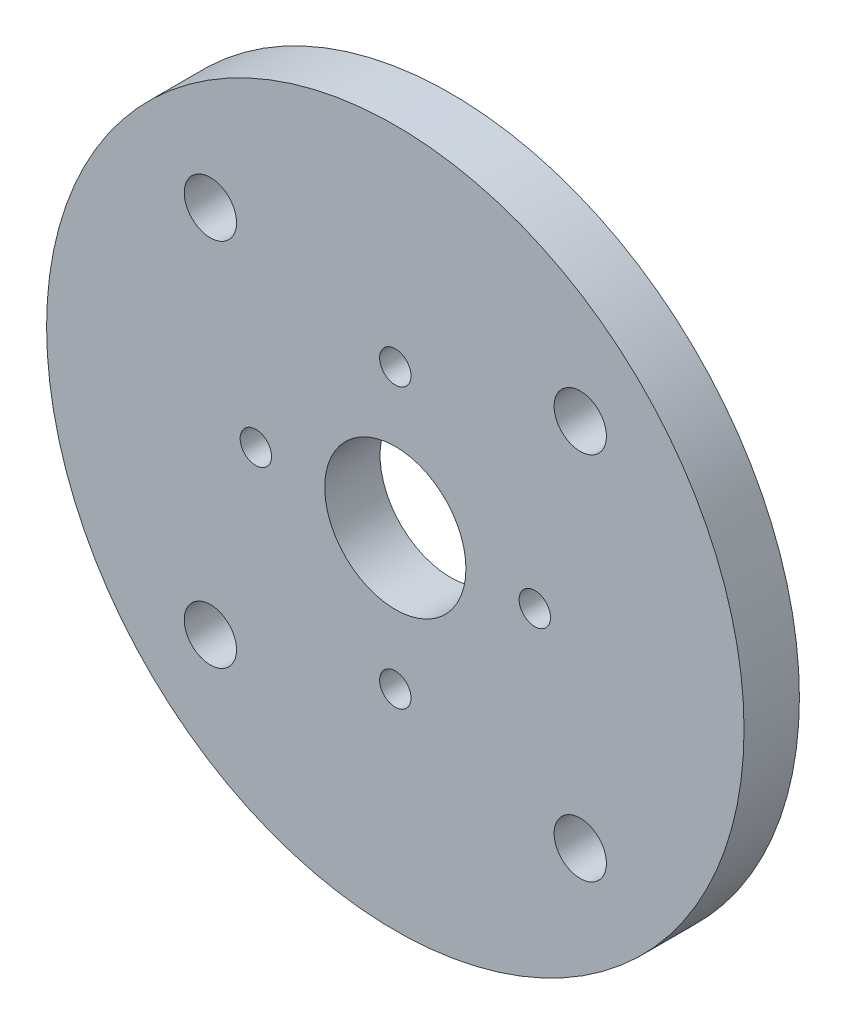
ISO-10303-21;
HEADER;
FILE_DESCRIPTION(('STEP AP214'),'2;1');
FILE_NAME('part.step','',(''),(''),'','','');
FILE_SCHEMA(('AUTOMOTIVE_DESIGN { 1 0 10303 214 1 1 1 1 }'));
ENDSEC;
DATA;
#1=APPLICATION_CONTEXT('core data for automotive mechanical design processes');
#2=APPLICATION_PROTOCOL_DEFINITION('international standard','automotive_design',2000,#1);
#3=PRODUCT_CONTEXT('',#1,'mechanical');
#4=PRODUCT('Part','Part','',(#3));
#5=PRODUCT_RELATED_PRODUCT_CATEGORY('part','',(#4));
#6=PRODUCT_DEFINITION_FORMATION('','',#4);
#7=PRODUCT_DEFINITION_CONTEXT('part definition',#1,'design');
#8=PRODUCT_DEFINITION('design','',#6,#7);
#9=PRODUCT_DEFINITION_SHAPE('','',#8);
#10=(LENGTH_UNIT() NAMED_UNIT(*) SI_UNIT(.MILLI.,.METRE.));
#11=(NAMED_UNIT(*) PLANE_ANGLE_UNIT() SI_UNIT($,.RADIAN.));
#12=(NAMED_UNIT(*) SI_UNIT($,.STERADIAN.) SOLID_ANGLE_UNIT());
#13=UNCERTAINTY_MEASURE_WITH_UNIT(LENGTH_MEASURE(1.E-05),#10,'distance_accuracy_value','');
#14=(GEOMETRIC_REPRESENTATION_CONTEXT(3) GLOBAL_UNCERTAINTY_ASSIGNED_CONTEXT((#13)) GLOBAL_UNIT_ASSIGNED_CONTEXT((#10,
#11,#12)) REPRESENTATION_CONTEXT('',''));
#15=CARTESIAN_POINT('',(0.,0.,0.));
#16=DIRECTION('',(0.,0.,1.));
#17=DIRECTION('',(1.,0.,0.));
#18=AXIS2_PLACEMENT_3D('',#15,#16,#17);
#19=CARTESIAN_POINT('',(0.,0.,3.175));
#20=DIRECTION('',(0.,0.,-1.));
#21=DIRECTION('',(-1.,0.,0.));
#22=AXIS2_PLACEMENT_3D('',#19,#20,#21);
#23=CYLINDRICAL_SURFACE('',#22,20.);
#24=CARTESIAN_POINT('',(0.,0.,3.175));
#25=DIRECTION('',(0.,0.,1.));
#26=DIRECTION('',(1.,0.,0.));
#27=AXIS2_PLACEMENT_3D('',#24,#25,#26);
#28=CIRCLE('',#27,20.);
#29=CARTESIAN_POINT('',(20.,0.,3.175));
#30=VERTEX_POINT('',#29);
#31=EDGE_CURVE('E10',#30,#30,#28,.T.);
#32=ORIENTED_EDGE('',*,*,#31,.F.);
#33=EDGE_LOOP('',(#32));
#34=FACE_BOUND('',#33,.T.);
#35=CARTESIAN_POINT('',(0.,0.,0.));
#36=DIRECTION('',(0.,0.,1.));
#37=DIRECTION('',(1.,0.,0.));
#38=AXIS2_PLACEMENT_3D('',#35,#36,#37);
#39=CIRCLE('',#38,20.);
#40=CARTESIAN_POINT('',(20.,0.,0.));
#41=VERTEX_POINT('',#40);
#42=EDGE_CURVE('E39',#41,#41,#39,.T.);
#43=ORIENTED_EDGE('',*,*,#42,.T.);
#44=EDGE_LOOP('',(#43));
#45=FACE_BOUND('',#44,.T.);
#46=ADVANCED_FACE('F36',(#34,#45),#23,.T.);
#47=CARTESIAN_POINT('',(0.,0.,3.175));
#48=DIRECTION('',(0.,0.,1.));
#49=DIRECTION('',(1.,0.,0.));
#50=AXIS2_PLACEMENT_3D('',#47,#48,#49);
#51=PLANE('',#50);
#52=CARTESIAN_POINT('',(-10.6066017177982,10.6066017177982,3.175));
#53=DIRECTION('',(0.,0.,1.));
#54=DIRECTION('',(1.,0.,0.));
#55=AXIS2_PLACEMENT_3D('',#52,#53,#54);
#56=CIRCLE('',#55,1.5);
#57=CARTESIAN_POINT('',(-9.10660171779824,10.6066017177982,3.175));
#58=VERTEX_POINT('',#57);
#59=EDGE_CURVE('E79',#58,#58,#56,.T.);
#60=ORIENTED_EDGE('',*,*,#59,.F.);
#61=EDGE_LOOP('',(#60));
#62=FACE_BOUND('',#61,.T.);
#63=CARTESIAN_POINT('',(-10.6066017177982,-10.6066017177982,3.175));
#64=DIRECTION('',(0.,0.,1.));
#65=DIRECTION('',(1.,0.,0.));
#66=AXIS2_PLACEMENT_3D('',#63,#64,#65);
#67=CIRCLE('',#66,1.5);
#68=CARTESIAN_POINT('',(-9.10660171779819,-10.6066017177982,3.175));
#69=VERTEX_POINT('',#68);
#70=EDGE_CURVE('E93',#69,#69,#67,.T.);
#71=ORIENTED_EDGE('',*,*,#70,.F.);
#72=EDGE_LOOP('',(#71));
#73=FACE_BOUND('',#72,.T.);
#74=CARTESIAN_POINT('',(10.6066017177982,-10.6066017177982,3.175));
#75=DIRECTION('',(0.,0.,1.));
#76=DIRECTION('',(1.,0.,0.));
#77=AXIS2_PLACEMENT_3D('',#74,#75,#76);
#78=CIRCLE('',#77,1.5);
#79=CARTESIAN_POINT('',(12.1066017177982,-10.6066017177982,3.175));
#80=VERTEX_POINT('',#79);
#81=EDGE_CURVE('E97',#80,#80,#78,.T.);
#82=ORIENTED_EDGE('',*,*,#81,.F.);
#83=EDGE_LOOP('',(#82));
#84=FACE_BOUND('',#83,.T.);
#85=CARTESIAN_POINT('',(10.6066017177982,10.6066017177982,3.175));
#86=DIRECTION('',(0.,0.,1.));
#87=DIRECTION('',(1.,0.,0.));
#88=AXIS2_PLACEMENT_3D('',#85,#86,#87);
#89=CIRCLE('',#88,1.5);
#90=CARTESIAN_POINT('',(12.1066017177982,10.6066017177982,3.175));
#91=VERTEX_POINT('',#90);
#92=EDGE_CURVE('E101',#91,#91,#89,.T.);
#93=ORIENTED_EDGE('',*,*,#92,.F.);
#94=EDGE_LOOP('',(#93));
#95=FACE_BOUND('',#94,.T.);
#96=CARTESIAN_POINT('',(0.,8.,3.175));
#97=DIRECTION('',(0.,0.,1.));
#98=DIRECTION('',(1.,0.,0.));
#99=AXIS2_PLACEMENT_3D('',#96,#97,#98);
#100=CIRCLE('',#99,0.9);
#101=CARTESIAN_POINT('',(0.9,8.,3.175));
#102=VERTEX_POINT('',#101);
#103=EDGE_CURVE('E67',#102,#102,#100,.T.);
#104=ORIENTED_EDGE('',*,*,#103,.F.);
#105=EDGE_LOOP('',(#104));
#106=FACE_BOUND('',#105,.T.);
#107=CARTESIAN_POINT('',(8.,0.,3.175));
#108=DIRECTION('',(0.,0.,1.));
#109=DIRECTION('',(1.,0.,0.));
#110=AXIS2_PLACEMENT_3D('',#107,#108,#109);
#111=CIRCLE('',#110,0.9);
#112=CARTESIAN_POINT('',(8.9,0.,3.175));
#113=VERTEX_POINT('',#112);
#114=EDGE_CURVE('E58',#113,#113,#111,.T.);
#115=ORIENTED_EDGE('',*,*,#114,.F.);
#116=EDGE_LOOP('',(#115));
#117=FACE_BOUND('',#116,.T.);
#118=CARTESIAN_POINT('',(0.,-8.,3.175));
#119=DIRECTION('',(0.,0.,1.));
#120=DIRECTION('',(1.,0.,0.));
#121=AXIS2_PLACEMENT_3D('',#118,#119,#120);
#122=CIRCLE('',#121,0.9);
#123=CARTESIAN_POINT('',(0.899999999999998,-8.,3.175));
#124=VERTEX_POINT('',#123);
#125=EDGE_CURVE('E83',#124,#124,#122,.T.);
#126=ORIENTED_EDGE('',*,*,#125,.F.);
#127=EDGE_LOOP('',(#126));
#128=FACE_BOUND('',#127,.T.);
#129=CARTESIAN_POINT('',(-8.,0.,3.175));
#130=DIRECTION('',(0.,0.,1.));
#131=DIRECTION('',(1.,0.,0.));
#132=AXIS2_PLACEMENT_3D('',#129,#130,#131);
#133=CIRCLE('',#132,0.899999999999999);
#134=CARTESIAN_POINT('',(-7.1,0.,3.175));
#135=VERTEX_POINT('',#134);
#136=EDGE_CURVE('E74',#135,#135,#133,.T.);
#137=ORIENTED_EDGE('',*,*,#136,.F.);
#138=EDGE_LOOP('',(#137));
#139=FACE_BOUND('',#138,.T.);
#140=CARTESIAN_POINT('',(0.,0.,3.175));
#141=DIRECTION('',(0.,0.,1.));
#142=DIRECTION('',(1.,0.,0.));
#143=AXIS2_PLACEMENT_3D('',#140,#141,#142);
#144=CIRCLE('',#143,4.05);
#145=CARTESIAN_POINT('',(4.05,0.,3.175));
#146=VERTEX_POINT('',#145);
#147=EDGE_CURVE('E50',#146,#146,#144,.T.);
#148=ORIENTED_EDGE('',*,*,#147,.F.);
#149=EDGE_LOOP('',(#148));
#150=FACE_BOUND('',#149,.T.);
#151=ORIENTED_EDGE('',*,*,#31,.T.);
#152=EDGE_LOOP('',(#151));
#153=FACE_BOUND('',#152,.T.);
#154=ADVANCED_FACE('F142',(#62,#73,#84,#95,#106,#117,#128,#139,#150,#153),#51,.T.);
#155=CARTESIAN_POINT('',(0.,0.,0.));
#156=DIRECTION('',(0.,0.,1.));
#157=DIRECTION('',(1.,0.,0.));
#158=AXIS2_PLACEMENT_3D('',#155,#156,#157);
#159=PLANE('',#158);
#160=CARTESIAN_POINT('',(-10.6066017177982,10.6066017177982,0.));
#161=DIRECTION('',(0.,0.,1.));
#162=DIRECTION('',(1.,0.,0.));
#163=AXIS2_PLACEMENT_3D('',#160,#161,#162);
#164=CIRCLE('',#163,1.5);
#165=CARTESIAN_POINT('',(-9.10660171779824,10.6066017177982,0.));
#166=VERTEX_POINT('',#165);
#167=EDGE_CURVE('E110',#166,#166,#164,.T.);
#168=ORIENTED_EDGE('',*,*,#167,.T.);
#169=EDGE_LOOP('',(#168));
#170=FACE_BOUND('',#169,.T.);
#171=CARTESIAN_POINT('',(-10.6066017177982,-10.6066017177982,0.));
#172=DIRECTION('',(0.,0.,1.));
#173=DIRECTION('',(1.,0.,0.));
#174=AXIS2_PLACEMENT_3D('',#171,#172,#173);
#175=CIRCLE('',#174,1.5);
#176=CARTESIAN_POINT('',(-9.10660171779819,-10.6066017177982,0.));
#177=VERTEX_POINT('',#176);
#178=EDGE_CURVE('E114',#177,#177,#175,.T.);
#179=ORIENTED_EDGE('',*,*,#178,.T.);
#180=EDGE_LOOP('',(#179));
#181=FACE_BOUND('',#180,.T.);
#182=CARTESIAN_POINT('',(10.6066017177982,-10.6066017177982,0.));
#183=DIRECTION('',(0.,0.,1.));
#184=DIRECTION('',(1.,0.,0.));
#185=AXIS2_PLACEMENT_3D('',#182,#183,#184);
#186=CIRCLE('',#185,1.5);
#187=CARTESIAN_POINT('',(12.1066017177982,-10.6066017177982,0.));
#188=VERTEX_POINT('',#187);
#189=EDGE_CURVE('E109',#188,#188,#186,.T.);
#190=ORIENTED_EDGE('',*,*,#189,.T.);
#191=EDGE_LOOP('',(#190));
#192=FACE_BOUND('',#191,.T.);
#193=CARTESIAN_POINT('',(10.6066017177982,10.6066017177982,0.));
#194=DIRECTION('',(0.,0.,1.));
#195=DIRECTION('',(1.,0.,0.));
#196=AXIS2_PLACEMENT_3D('',#193,#194,#195);
#197=CIRCLE('',#196,1.5);
#198=CARTESIAN_POINT('',(12.1066017177982,10.6066017177982,0.));
#199=VERTEX_POINT('',#198);
#200=EDGE_CURVE('E105',#199,#199,#197,.T.);
#201=ORIENTED_EDGE('',*,*,#200,.T.);
#202=EDGE_LOOP('',(#201));
#203=FACE_BOUND('',#202,.T.);
#204=CARTESIAN_POINT('',(0.,8.,0.));
#205=DIRECTION('',(0.,0.,1.));
#206=DIRECTION('',(1.,0.,0.));
#207=AXIS2_PLACEMENT_3D('',#204,#205,#206);
#208=CIRCLE('',#207,0.9);
#209=CARTESIAN_POINT('',(0.9,8.,0.));
#210=VERTEX_POINT('',#209);
#211=EDGE_CURVE('E54',#210,#210,#208,.T.);
#212=ORIENTED_EDGE('',*,*,#211,.T.);
#213=EDGE_LOOP('',(#212));
#214=FACE_BOUND('',#213,.T.);
#215=CARTESIAN_POINT('',(8.,0.,0.));
#216=DIRECTION('',(0.,0.,1.));
#217=DIRECTION('',(1.,0.,0.));
#218=AXIS2_PLACEMENT_3D('',#215,#216,#217);
#219=CIRCLE('',#218,0.9);
#220=CARTESIAN_POINT('',(8.9,0.,0.));
#221=VERTEX_POINT('',#220);
#222=EDGE_CURVE('E62',#221,#221,#219,.T.);
#223=ORIENTED_EDGE('',*,*,#222,.T.);
#224=EDGE_LOOP('',(#223));
#225=FACE_BOUND('',#224,.T.);
#226=CARTESIAN_POINT('',(0.,-8.,0.));
#227=DIRECTION('',(0.,0.,1.));
#228=DIRECTION('',(1.,0.,0.));
#229=AXIS2_PLACEMENT_3D('',#226,#227,#228);
#230=CIRCLE('',#229,0.9);
#231=CARTESIAN_POINT('',(0.899999999999998,-8.,0.));
#232=VERTEX_POINT('',#231);
#233=EDGE_CURVE('E63',#232,#232,#230,.T.);
#234=ORIENTED_EDGE('',*,*,#233,.T.);
#235=EDGE_LOOP('',(#234));
#236=FACE_BOUND('',#235,.T.);
#237=CARTESIAN_POINT('',(-8.,0.,0.));
#238=DIRECTION('',(0.,0.,1.));
#239=DIRECTION('',(1.,0.,0.));
#240=AXIS2_PLACEMENT_3D('',#237,#238,#239);
#241=CIRCLE('',#240,0.899999999999999);
#242=CARTESIAN_POINT('',(-7.1,0.,0.));
#243=VERTEX_POINT('',#242);
#244=EDGE_CURVE('E78',#243,#243,#241,.T.);
#245=ORIENTED_EDGE('',*,*,#244,.T.);
#246=EDGE_LOOP('',(#245));
#247=FACE_BOUND('',#246,.T.);
#248=CARTESIAN_POINT('',(0.,0.,0.));
#249=DIRECTION('',(0.,0.,1.));
#250=DIRECTION('',(1.,0.,0.));
#251=AXIS2_PLACEMENT_3D('',#248,#249,#250);
#252=CIRCLE('',#251,4.05);
#253=CARTESIAN_POINT('',(4.05,0.,0.));
#254=VERTEX_POINT('',#253);
#255=EDGE_CURVE('E48',#254,#254,#252,.T.);
#256=ORIENTED_EDGE('',*,*,#255,.T.);
#257=EDGE_LOOP('',(#256));
#258=FACE_BOUND('',#257,.T.);
#259=ORIENTED_EDGE('',*,*,#42,.F.);
#260=EDGE_LOOP('',(#259));
#261=FACE_BOUND('',#260,.T.);
#262=ADVANCED_FACE('F122',(#170,#181,#192,#203,#214,#225,#236,#247,#258,#261),#159,.F.);
#263=CARTESIAN_POINT('',(0.,0.,0.));
#264=DIRECTION('',(0.,0.,1.));
#265=DIRECTION('',(1.,0.,0.));
#266=AXIS2_PLACEMENT_3D('',#263,#264,#265);
#267=CYLINDRICAL_SURFACE('',#266,4.05);
#268=ORIENTED_EDGE('',*,*,#255,.F.);
#269=EDGE_LOOP('',(#268));
#270=FACE_BOUND('',#269,.T.);
#271=ORIENTED_EDGE('',*,*,#147,.T.);
#272=EDGE_LOOP('',(#271));
#273=FACE_BOUND('',#272,.T.);
#274=ADVANCED_FACE('F154',(#270,#273),#267,.F.);
#275=CARTESIAN_POINT('',(-8.,0.,0.));
#276=DIRECTION('',(0.,0.,1.));
#277=DIRECTION('',(1.,0.,0.));
#278=AXIS2_PLACEMENT_3D('',#275,#276,#277);
#279=CYLINDRICAL_SURFACE('',#278,0.899999999999999);
#280=ORIENTED_EDGE('',*,*,#244,.F.);
#281=EDGE_LOOP('',(#280));
#282=FACE_BOUND('',#281,.T.);
#283=ORIENTED_EDGE('',*,*,#136,.T.);
#284=EDGE_LOOP('',(#283));
#285=FACE_BOUND('',#284,.T.);
#286=ADVANCED_FACE('F160',(#282,#285),#279,.F.);
#287=CARTESIAN_POINT('',(0.,-8.,0.));
#288=DIRECTION('',(0.,0.,1.));
#289=DIRECTION('',(1.,0.,0.));
#290=AXIS2_PLACEMENT_3D('',#287,#288,#289);
#291=CYLINDRICAL_SURFACE('',#290,0.9);
#292=ORIENTED_EDGE('',*,*,#233,.F.);
#293=EDGE_LOOP('',(#292));
#294=FACE_BOUND('',#293,.T.);
#295=ORIENTED_EDGE('',*,*,#125,.T.);
#296=EDGE_LOOP('',(#295));
#297=FACE_BOUND('',#296,.T.);
#298=ADVANCED_FACE('F168',(#294,#297),#291,.F.);
#299=CARTESIAN_POINT('',(8.,0.,0.));
#300=DIRECTION('',(0.,0.,1.));
#301=DIRECTION('',(1.,0.,0.));
#302=AXIS2_PLACEMENT_3D('',#299,#300,#301);
#303=CYLINDRICAL_SURFACE('',#302,0.9);
#304=ORIENTED_EDGE('',*,*,#222,.F.);
#305=EDGE_LOOP('',(#304));
#306=FACE_BOUND('',#305,.T.);
#307=ORIENTED_EDGE('',*,*,#114,.T.);
#308=EDGE_LOOP('',(#307));
#309=FACE_BOUND('',#308,.T.);
#310=ADVANCED_FACE('F165',(#306,#309),#303,.F.);
#311=CARTESIAN_POINT('',(0.,8.,0.));
#312=DIRECTION('',(0.,0.,1.));
#313=DIRECTION('',(1.,0.,0.));
#314=AXIS2_PLACEMENT_3D('',#311,#312,#313);
#315=CYLINDRICAL_SURFACE('',#314,0.9);
#316=ORIENTED_EDGE('',*,*,#211,.F.);
#317=EDGE_LOOP('',(#316));
#318=FACE_BOUND('',#317,.T.);
#319=ORIENTED_EDGE('',*,*,#103,.T.);
#320=EDGE_LOOP('',(#319));
#321=FACE_BOUND('',#320,.T.);
#322=ADVANCED_FACE('F138',(#318,#321),#315,.F.);
#323=CARTESIAN_POINT('',(10.6066017177982,10.6066017177982,0.));
#324=DIRECTION('',(0.,0.,1.));
#325=DIRECTION('',(1.,0.,0.));
#326=AXIS2_PLACEMENT_3D('',#323,#324,#325);
#327=CYLINDRICAL_SURFACE('',#326,1.5);
#328=ORIENTED_EDGE('',*,*,#92,.T.);
#329=EDGE_LOOP('',(#328));
#330=FACE_BOUND('',#329,.T.);
#331=ORIENTED_EDGE('',*,*,#200,.F.);
#332=EDGE_LOOP('',(#331));
#333=FACE_BOUND('',#332,.T.);
#334=ADVANCED_FACE('F128',(#330,#333),#327,.F.);
#335=CARTESIAN_POINT('',(10.6066017177982,-10.6066017177982,0.));
#336=DIRECTION('',(0.,0.,1.));
#337=DIRECTION('',(1.,0.,0.));
#338=AXIS2_PLACEMENT_3D('',#335,#336,#337);
#339=CYLINDRICAL_SURFACE('',#338,1.5);
#340=ORIENTED_EDGE('',*,*,#81,.T.);
#341=EDGE_LOOP('',(#340));
#342=FACE_BOUND('',#341,.T.);
#343=ORIENTED_EDGE('',*,*,#189,.F.);
#344=EDGE_LOOP('',(#343));
#345=FACE_BOUND('',#344,.T.);
#346=ADVANCED_FACE('F125',(#342,#345),#339,.F.);
#347=CARTESIAN_POINT('',(-10.6066017177982,-10.6066017177982,0.));
#348=DIRECTION('',(0.,0.,1.));
#349=DIRECTION('',(1.,0.,0.));
#350=AXIS2_PLACEMENT_3D('',#347,#348,#349);
#351=CYLINDRICAL_SURFACE('',#350,1.5);
#352=ORIENTED_EDGE('',*,*,#70,.T.);
#353=EDGE_LOOP('',(#352));
#354=FACE_BOUND('',#353,.T.);
#355=ORIENTED_EDGE('',*,*,#178,.F.);
#356=EDGE_LOOP('',(#355));
#357=FACE_BOUND('',#356,.T.);
#358=ADVANCED_FACE('F127',(#354,#357),#351,.F.);
#359=CARTESIAN_POINT('',(-10.6066017177982,10.6066017177982,0.));
#360=DIRECTION('',(0.,0.,1.));
#361=DIRECTION('',(1.,0.,0.));
#362=AXIS2_PLACEMENT_3D('',#359,#360,#361);
#363=CYLINDRICAL_SURFACE('',#362,1.5);
#364=ORIENTED_EDGE('',*,*,#59,.T.);
#365=EDGE_LOOP('',(#364));
#366=FACE_BOUND('',#365,.T.);
#367=ORIENTED_EDGE('',*,*,#167,.F.);
#368=EDGE_LOOP('',(#367));
#369=FACE_BOUND('',#368,.T.);
#370=ADVANCED_FACE('F135',(#366,#369),#363,.F.);
#371=CLOSED_SHELL('',(#46,#154,#262,#274,#286,#298,#310,#322,#334,#346,#358,#370));
#372=MANIFOLD_SOLID_BREP('B2',#371);
#373=ADVANCED_BREP_SHAPE_REPRESENTATION('',(#18,#372),#14);
#374=SHAPE_DEFINITION_REPRESENTATION(#9,#373);
ENDSEC;
END-ISO-10303-21;
